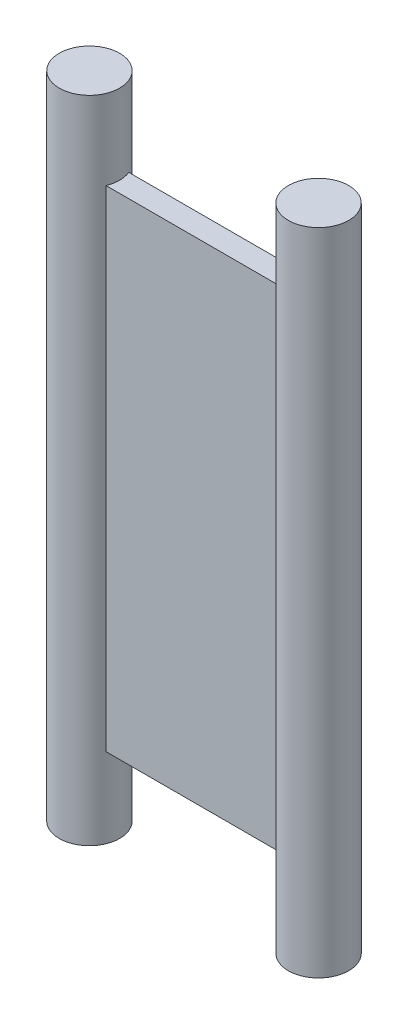
ISO-10303-21;
HEADER;
FILE_DESCRIPTION(('STEP AP214'),'2;1');
FILE_NAME('part.step','',(''),(''),'','','');
FILE_SCHEMA(('AUTOMOTIVE_DESIGN { 1 0 10303 214 1 1 1 1 }'));
ENDSEC;
DATA;
#1=APPLICATION_CONTEXT('core data for automotive mechanical design processes');
#2=APPLICATION_PROTOCOL_DEFINITION('international standard','automotive_design',2000,#1);
#3=PRODUCT_CONTEXT('',#1,'mechanical');
#4=PRODUCT('Part','Part','',(#3));
#5=PRODUCT_RELATED_PRODUCT_CATEGORY('part','',(#4));
#6=PRODUCT_DEFINITION_FORMATION('','',#4);
#7=PRODUCT_DEFINITION_CONTEXT('part definition',#1,'design');
#8=PRODUCT_DEFINITION('design','',#6,#7);
#9=PRODUCT_DEFINITION_SHAPE('','',#8);
#10=(LENGTH_UNIT() NAMED_UNIT(*) SI_UNIT(.MILLI.,.METRE.));
#11=(NAMED_UNIT(*) PLANE_ANGLE_UNIT() SI_UNIT($,.RADIAN.));
#12=(NAMED_UNIT(*) SI_UNIT($,.STERADIAN.) SOLID_ANGLE_UNIT());
#13=UNCERTAINTY_MEASURE_WITH_UNIT(LENGTH_MEASURE(1.E-05),#10,'distance_accuracy_value','');
#14=(GEOMETRIC_REPRESENTATION_CONTEXT(3) GLOBAL_UNCERTAINTY_ASSIGNED_CONTEXT((#13)) GLOBAL_UNIT_ASSIGNED_CONTEXT((#10,
#11,#12)) REPRESENTATION_CONTEXT('',''));
#15=CARTESIAN_POINT('',(0.,0.,0.));
#16=DIRECTION('',(0.,0.,1.));
#17=DIRECTION('',(1.,0.,0.));
#18=AXIS2_PLACEMENT_3D('',#15,#16,#17);
#19=CARTESIAN_POINT('',(5.0235,21.5,0.499999999999999));
#20=DIRECTION('',(0.,0.,-1.));
#21=DIRECTION('',(-1.,0.,0.));
#22=AXIS2_PLACEMENT_3D('',#19,#20,#21);
#23=PLANE('',#22);
#24=DIRECTION('',(0.,-1.,0.));
#25=VECTOR('',#24,1.);
#26=CARTESIAN_POINT('',(3.7964608808192,25.,0.499999999999999));
#27=LINE('',#26,#25);
#28=CARTESIAN_POINT('',(3.7964608808192,21.5,0.499999999999999));
#29=VERTEX_POINT('',#28);
#30=CARTESIAN_POINT('',(3.7964608808192,0.,0.499999999999999));
#31=VERTEX_POINT('',#30);
#32=EDGE_CURVE('E51',#29,#31,#27,.T.);
#33=ORIENTED_EDGE('',*,*,#32,.F.);
#34=DIRECTION('',(1.,0.,0.));
#35=VECTOR('',#34,1.);
#36=CARTESIAN_POINT('',(5.0235,21.5,0.499999999999999));
#37=LINE('',#36,#35);
#38=CARTESIAN_POINT('',(-3.7964608808192,21.5,0.5));
#39=VERTEX_POINT('',#38);
#40=EDGE_CURVE('E88',#39,#29,#37,.T.);
#41=ORIENTED_EDGE('',*,*,#40,.F.);
#42=DIRECTION('',(0.,-1.,0.));
#43=VECTOR('',#42,1.);
#44=CARTESIAN_POINT('',(-3.7964608808192,25.,0.5));
#45=LINE('',#44,#43);
#46=CARTESIAN_POINT('',(-3.7964608808192,0.,0.5));
#47=VERTEX_POINT('',#46);
#48=EDGE_CURVE('E101',#47,#39,#45,.F.);
#49=ORIENTED_EDGE('',*,*,#48,.F.);
#50=DIRECTION('',(1.,0.,0.));
#51=VECTOR('',#50,1.);
#52=CARTESIAN_POINT('',(5.0235,0.,0.499999999999999));
#53=LINE('',#52,#51);
#54=EDGE_CURVE('E89',#47,#31,#53,.T.);
#55=ORIENTED_EDGE('',*,*,#54,.T.);
#56=EDGE_LOOP('',(#33,#41,#49,#55));
#57=FACE_BOUND('',#56,.T.);
#58=ADVANCED_FACE('F37',(#57),#23,.F.);
#59=CARTESIAN_POINT('',(5.0235,21.5,-0.500000000000001));
#60=DIRECTION('',(0.,0.,1.));
#61=DIRECTION('',(1.,0.,0.));
#62=AXIS2_PLACEMENT_3D('',#59,#60,#61);
#63=PLANE('',#62);
#64=DIRECTION('',(0.,-1.,0.));
#65=VECTOR('',#64,1.);
#66=CARTESIAN_POINT('',(3.7964608808192,25.,-0.500000000000001));
#67=LINE('',#66,#65);
#68=CARTESIAN_POINT('',(3.7964608808192,0.,-0.5));
#69=VERTEX_POINT('',#68);
#70=CARTESIAN_POINT('',(3.7964608808192,21.5,-0.500000000000001));
#71=VERTEX_POINT('',#70);
#72=EDGE_CURVE('E76',#69,#71,#67,.F.);
#73=ORIENTED_EDGE('',*,*,#72,.F.);
#74=DIRECTION('',(-1.,0.,0.));
#75=VECTOR('',#74,1.);
#76=CARTESIAN_POINT('',(5.0235,0.,-0.500000000000001));
#77=LINE('',#76,#75);
#78=CARTESIAN_POINT('',(-3.7964608808192,0.,-0.499999999999999));
#79=VERTEX_POINT('',#78);
#80=EDGE_CURVE('E58',#69,#79,#77,.T.);
#81=ORIENTED_EDGE('',*,*,#80,.T.);
#82=DIRECTION('',(0.,-1.,0.));
#83=VECTOR('',#82,1.);
#84=CARTESIAN_POINT('',(-3.7964608808192,25.,-0.5));
#85=LINE('',#84,#83);
#86=CARTESIAN_POINT('',(-3.7964608808192,21.5,-0.5));
#87=VERTEX_POINT('',#86);
#88=EDGE_CURVE('E103',#87,#79,#85,.T.);
#89=ORIENTED_EDGE('',*,*,#88,.F.);
#90=DIRECTION('',(-1.,0.,0.));
#91=VECTOR('',#90,1.);
#92=CARTESIAN_POINT('',(5.0235,21.5,-0.500000000000001));
#93=LINE('',#92,#91);
#94=EDGE_CURVE('E83',#71,#87,#93,.T.);
#95=ORIENTED_EDGE('',*,*,#94,.F.);
#96=EDGE_LOOP('',(#73,#81,#89,#95));
#97=FACE_BOUND('',#96,.T.);
#98=ADVANCED_FACE('F82',(#97),#63,.F.);
#99=CARTESIAN_POINT('',(-5.0235,25.,0.));
#100=DIRECTION('',(0.,-1.,0.));
#101=DIRECTION('',(0.,0.,-1.));
#102=AXIS2_PLACEMENT_3D('',#99,#100,#101);
#103=CYLINDRICAL_SURFACE('',#102,1.325);
#104=CARTESIAN_POINT('',(-5.0235,25.,0.));
#105=DIRECTION('',(0.,1.,0.));
#106=DIRECTION('',(0.,0.,1.));
#107=AXIS2_PLACEMENT_3D('',#104,#105,#106);
#108=CIRCLE('',#107,1.325);
#109=CARTESIAN_POINT('',(-5.0235,25.,1.325));
#110=VERTEX_POINT('',#109);
#111=EDGE_CURVE('E105',#110,#110,#108,.T.);
#112=ORIENTED_EDGE('',*,*,#111,.F.);
#113=EDGE_LOOP('',(#112));
#114=FACE_BOUND('',#113,.T.);
#115=CARTESIAN_POINT('',(-5.0235,-3.5,0.));
#116=DIRECTION('',(0.,1.,0.));
#117=DIRECTION('',(0.,0.,1.));
#118=AXIS2_PLACEMENT_3D('',#115,#116,#117);
#119=CIRCLE('',#118,1.325);
#120=CARTESIAN_POINT('',(-5.0235,-3.5,1.325));
#121=VERTEX_POINT('',#120);
#122=EDGE_CURVE('E106',#121,#121,#119,.T.);
#123=ORIENTED_EDGE('',*,*,#122,.T.);
#124=EDGE_LOOP('',(#123));
#125=FACE_BOUND('',#124,.T.);
#126=ORIENTED_EDGE('',*,*,#48,.T.);
#127=CARTESIAN_POINT('',(-5.0235,21.5,0.));
#128=DIRECTION('',(0.,-1.,0.));
#129=DIRECTION('',(0.,0.,-1.));
#130=AXIS2_PLACEMENT_3D('',#127,#128,#129);
#131=CIRCLE('',#130,1.325);
#132=EDGE_CURVE('E93',#39,#87,#131,.F.);
#133=ORIENTED_EDGE('',*,*,#132,.T.);
#134=ORIENTED_EDGE('',*,*,#88,.T.);
#135=CARTESIAN_POINT('',(-5.0235,0.,0.));
#136=DIRECTION('',(0.,-1.,0.));
#137=DIRECTION('',(0.,0.,-1.));
#138=AXIS2_PLACEMENT_3D('',#135,#136,#137);
#139=CIRCLE('',#138,1.325);
#140=EDGE_CURVE('E44',#47,#79,#139,.F.);
#141=ORIENTED_EDGE('',*,*,#140,.F.);
#142=EDGE_LOOP('',(#126,#133,#134,#141));
#143=FACE_BOUND('',#142,.T.);
#144=ADVANCED_FACE('F136',(#114,#125,#143),#103,.T.);
#145=CARTESIAN_POINT('',(-5.0235,25.,0.));
#146=DIRECTION('',(0.,1.,0.));
#147=DIRECTION('',(0.,0.,1.));
#148=AXIS2_PLACEMENT_3D('',#145,#146,#147);
#149=PLANE('',#148);
#150=ORIENTED_EDGE('',*,*,#111,.T.);
#151=EDGE_LOOP('',(#150));
#152=FACE_BOUND('',#151,.T.);
#153=ADVANCED_FACE('F142',(#152),#149,.T.);
#154=CARTESIAN_POINT('',(-5.0235,-3.5,0.));
#155=DIRECTION('',(0.,1.,0.));
#156=DIRECTION('',(0.,0.,1.));
#157=AXIS2_PLACEMENT_3D('',#154,#155,#156);
#158=PLANE('',#157);
#159=ORIENTED_EDGE('',*,*,#122,.F.);
#160=EDGE_LOOP('',(#159));
#161=FACE_BOUND('',#160,.T.);
#162=ADVANCED_FACE('F148',(#161),#158,.F.);
#163=CARTESIAN_POINT('',(0.,21.5,0.));
#164=DIRECTION('',(0.,-1.,0.));
#165=DIRECTION('',(0.,0.,-1.));
#166=AXIS2_PLACEMENT_3D('',#163,#164,#165);
#167=PLANE('',#166);
#168=CARTESIAN_POINT('',(5.0235,21.5,0.));
#169=DIRECTION('',(0.,-1.,0.));
#170=DIRECTION('',(0.,0.,-1.));
#171=AXIS2_PLACEMENT_3D('',#168,#169,#170);
#172=CIRCLE('',#171,1.325);
#173=EDGE_CURVE('E109',#71,#29,#172,.F.);
#174=ORIENTED_EDGE('',*,*,#173,.F.);
#175=ORIENTED_EDGE('',*,*,#94,.T.);
#176=ORIENTED_EDGE('',*,*,#132,.F.);
#177=ORIENTED_EDGE('',*,*,#40,.T.);
#178=EDGE_LOOP('',(#174,#175,#176,#177));
#179=FACE_BOUND('',#178,.T.);
#180=ADVANCED_FACE('F139',(#179),#167,.F.);
#181=CARTESIAN_POINT('',(0.,0.,0.));
#182=DIRECTION('',(0.,-1.,0.));
#183=DIRECTION('',(0.,0.,-1.));
#184=AXIS2_PLACEMENT_3D('',#181,#182,#183);
#185=PLANE('',#184);
#186=ORIENTED_EDGE('',*,*,#80,.F.);
#187=CARTESIAN_POINT('',(5.0235,0.,0.));
#188=DIRECTION('',(0.,-1.,0.));
#189=DIRECTION('',(0.,0.,-1.));
#190=AXIS2_PLACEMENT_3D('',#187,#188,#189);
#191=CIRCLE('',#190,1.325);
#192=EDGE_CURVE('E11',#69,#31,#191,.F.);
#193=ORIENTED_EDGE('',*,*,#192,.T.);
#194=ORIENTED_EDGE('',*,*,#54,.F.);
#195=ORIENTED_EDGE('',*,*,#140,.T.);
#196=EDGE_LOOP('',(#186,#193,#194,#195));
#197=FACE_BOUND('',#196,.T.);
#198=ADVANCED_FACE('F87',(#197),#185,.T.);
#199=CARTESIAN_POINT('',(5.0235,25.,0.));
#200=DIRECTION('',(0.,-1.,0.));
#201=DIRECTION('',(0.,0.,-1.));
#202=AXIS2_PLACEMENT_3D('',#199,#200,#201);
#203=CYLINDRICAL_SURFACE('',#202,1.325);
#204=CARTESIAN_POINT('',(5.0235,25.,0.));
#205=DIRECTION('',(0.,1.,0.));
#206=DIRECTION('',(0.,0.,1.));
#207=AXIS2_PLACEMENT_3D('',#204,#205,#206);
#208=CIRCLE('',#207,1.325);
#209=CARTESIAN_POINT('',(5.0235,25.,1.325));
#210=VERTEX_POINT('',#209);
#211=EDGE_CURVE('E114',#210,#210,#208,.T.);
#212=ORIENTED_EDGE('',*,*,#211,.F.);
#213=EDGE_LOOP('',(#212));
#214=FACE_BOUND('',#213,.T.);
#215=CARTESIAN_POINT('',(5.0235,-3.5,0.));
#216=DIRECTION('',(0.,1.,0.));
#217=DIRECTION('',(0.,0.,1.));
#218=AXIS2_PLACEMENT_3D('',#215,#216,#217);
#219=CIRCLE('',#218,1.325);
#220=CARTESIAN_POINT('',(5.0235,-3.5,1.325));
#221=VERTEX_POINT('',#220);
#222=EDGE_CURVE('E84',#221,#221,#219,.T.);
#223=ORIENTED_EDGE('',*,*,#222,.T.);
#224=EDGE_LOOP('',(#223));
#225=FACE_BOUND('',#224,.T.);
#226=ORIENTED_EDGE('',*,*,#72,.T.);
#227=ORIENTED_EDGE('',*,*,#173,.T.);
#228=ORIENTED_EDGE('',*,*,#32,.T.);
#229=ORIENTED_EDGE('',*,*,#192,.F.);
#230=EDGE_LOOP('',(#226,#227,#228,#229));
#231=FACE_BOUND('',#230,.T.);
#232=ADVANCED_FACE('F75',(#214,#225,#231),#203,.T.);
#233=CARTESIAN_POINT('',(5.0235,25.,0.));
#234=DIRECTION('',(0.,1.,0.));
#235=DIRECTION('',(0.,0.,1.));
#236=AXIS2_PLACEMENT_3D('',#233,#234,#235);
#237=PLANE('',#236);
#238=ORIENTED_EDGE('',*,*,#211,.T.);
#239=EDGE_LOOP('',(#238));
#240=FACE_BOUND('',#239,.T.);
#241=ADVANCED_FACE('F123',(#240),#237,.T.);
#242=CARTESIAN_POINT('',(5.0235,-3.5,0.));
#243=DIRECTION('',(0.,1.,0.));
#244=DIRECTION('',(0.,0.,1.));
#245=AXIS2_PLACEMENT_3D('',#242,#243,#244);
#246=PLANE('',#245);
#247=ORIENTED_EDGE('',*,*,#222,.F.);
#248=EDGE_LOOP('',(#247));
#249=FACE_BOUND('',#248,.T.);
#250=ADVANCED_FACE('F121',(#249),#246,.F.);
#251=CLOSED_SHELL('',(#58,#98,#144,#153,#162,#180,#198,#232,#241,#250));
#252=MANIFOLD_SOLID_BREP('B2',#251);
#253=ADVANCED_BREP_SHAPE_REPRESENTATION('',(#18,#252),#14);
#254=SHAPE_DEFINITION_REPRESENTATION(#9,#253);
ENDSEC;
END-ISO-10303-21;
